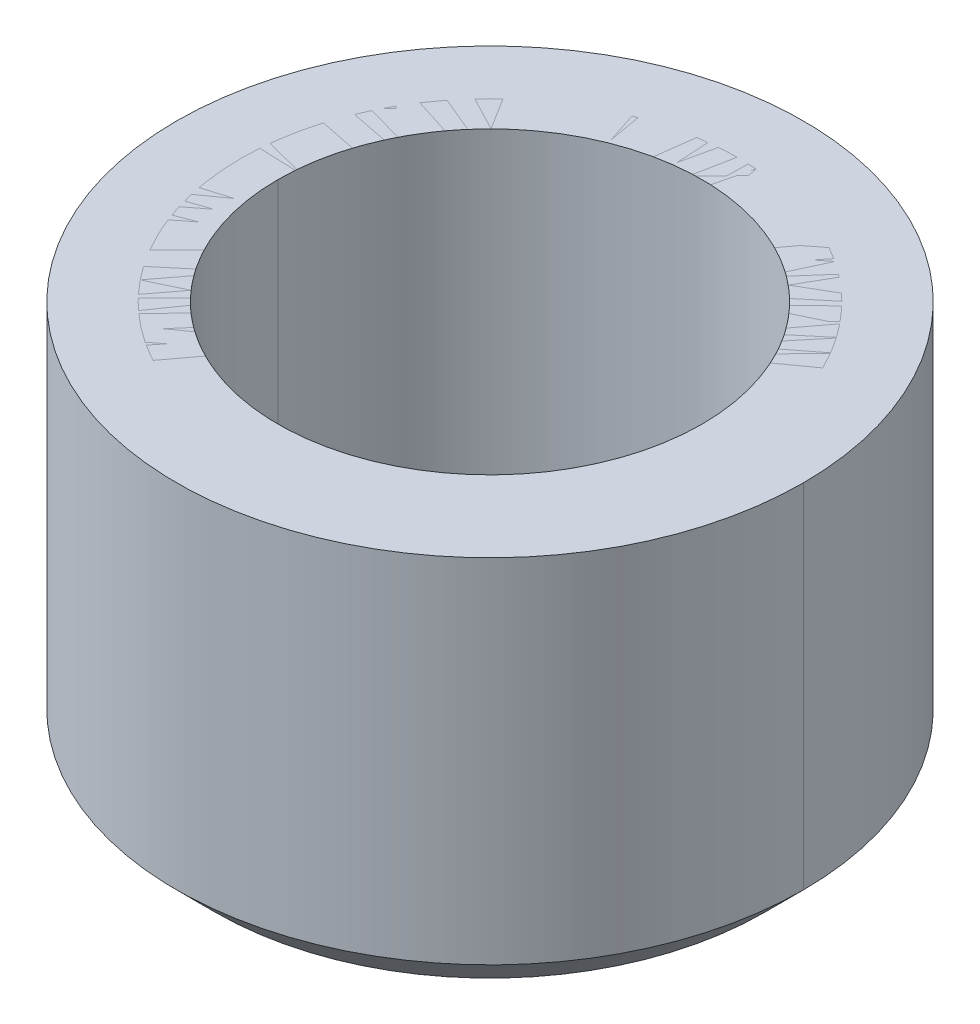
ISO-10303-21;
HEADER;
FILE_DESCRIPTION(('STEP AP214'),'2;1');
FILE_NAME('part.step','',(''),(''),'','','');
FILE_SCHEMA(('AUTOMOTIVE_DESIGN { 1 0 10303 214 1 1 1 1 }'));
ENDSEC;
DATA;
#1=APPLICATION_CONTEXT('core data for automotive mechanical design processes');
#2=APPLICATION_PROTOCOL_DEFINITION('international standard','automotive_design',2000,#1);
#3=PRODUCT_CONTEXT('',#1,'mechanical');
#4=PRODUCT('Part','Part','',(#3));
#5=PRODUCT_RELATED_PRODUCT_CATEGORY('part','',(#4));
#6=PRODUCT_DEFINITION_FORMATION('','',#4);
#7=PRODUCT_DEFINITION_CONTEXT('part definition',#1,'design');
#8=PRODUCT_DEFINITION('design','',#6,#7);
#9=PRODUCT_DEFINITION_SHAPE('','',#8);
#10=(LENGTH_UNIT() NAMED_UNIT(*) SI_UNIT(.MILLI.,.METRE.));
#11=(NAMED_UNIT(*) PLANE_ANGLE_UNIT() SI_UNIT($,.RADIAN.));
#12=(NAMED_UNIT(*) SI_UNIT($,.STERADIAN.) SOLID_ANGLE_UNIT());
#13=UNCERTAINTY_MEASURE_WITH_UNIT(LENGTH_MEASURE(1.E-05),#10,'distance_accuracy_value','');
#14=(GEOMETRIC_REPRESENTATION_CONTEXT(3) GLOBAL_UNCERTAINTY_ASSIGNED_CONTEXT((#13)) GLOBAL_UNIT_ASSIGNED_CONTEXT((#10,
#11,#12)) REPRESENTATION_CONTEXT('',''));
#15=CARTESIAN_POINT('',(0.,0.,0.));
#16=DIRECTION('',(0.,0.,1.));
#17=DIRECTION('',(1.,0.,0.));
#18=AXIS2_PLACEMENT_3D('',#15,#16,#17);
#19=CARTESIAN_POINT('',(0.,9.45,0.));
#20=DIRECTION('',(0.,-1.,0.));
#21=DIRECTION('',(-1.,0.,0.));
#22=AXIS2_PLACEMENT_3D('',#19,#20,#21);
#23=CYLINDRICAL_SURFACE('',#22,3.175);
#24=CARTESIAN_POINT('',(-3.175,5.,0.));
#25=CARTESIAN_POINT('',(-3.175,5.,-0.631260766134238));
#26=CARTESIAN_POINT('',(-2.93331751572333,5.,-1.21501989775916));
#27=CARTESIAN_POINT('',(-2.69194650064295,5.,-1.79802670764221));
#28=CARTESIAN_POINT('',(-2.24506403026729,5.,-2.24506403026729));
#29=CARTESIAN_POINT('',(-1.79895924259534,5.,-2.69132340070859));
#30=CARTESIAN_POINT('',(-1.21501989775916,5.,-2.93331751572333));
#31=CARTESIAN_POINT('',(-0.632096747467422,5.,-3.17489050292465));
#32=CARTESIAN_POINT('',(0.,5.,-3.175));
#33=CARTESIAN_POINT('',(0.630996747490972,5.,-3.17510930652417));
#34=CARTESIAN_POINT('',(1.21501989775916,5.,-2.93331751572333));
#35=CARTESIAN_POINT('',(1.79802670764314,5.,-2.69194650064252));
#36=CARTESIAN_POINT('',(2.24506403026729,5.,-2.24506403026729));
#37=CARTESIAN_POINT('',(2.69132340070859,5.,-1.79895924259485));
#38=CARTESIAN_POINT('',(2.93331751572333,5.,-1.21501989775916));
#39=CARTESIAN_POINT('',(3.175,5.,-0.631832527611024));
#40=CARTESIAN_POINT('',(3.175,5.,0.));
#41=B_SPLINE_CURVE_WITH_KNOTS('',2,(#24,#25,#26,#27,#28,#29,#30,#31,#32,#33,#34,#35,#36,#37,#38,
#39,#40),.UNSPECIFIED.,.F.,.F.,(3,2,2,2,2,2,2,2,3),(0.,0.125,0.25,0.375,0.5,0.625,0.75,0.875,
1.),.UNSPECIFIED.);
#42=CARTESIAN_POINT('',(-3.175,5.,0.));
#43=VERTEX_POINT('',#42);
#44=CARTESIAN_POINT('',(3.175,5.,0.));
#45=VERTEX_POINT('',#44);
#46=EDGE_CURVE('P0_E27',#43,#45,#41,.T.);
#47=ORIENTED_EDGE('',*,*,#46,.F.);
#48=CARTESIAN_POINT('',(-3.175,0.,0.));
#49=DIRECTION('',(0.,1.,0.));
#50=VECTOR('',#49,1.);
#51=LINE('',#48,#50);
#52=CARTESIAN_POINT('',(-3.175,0.,0.));
#53=VERTEX_POINT('',#52);
#54=EDGE_CURVE('P0_E119',#53,#43,#51,.T.);
#55=ORIENTED_EDGE('',*,*,#54,.F.);
#56=CARTESIAN_POINT('',(0.,0.,0.));
#57=DIRECTION('',(0.,-1.,0.));
#58=DIRECTION('',(-1.,0.,0.));
#59=AXIS2_PLACEMENT_3D('',#56,#57,#58);
#60=CIRCLE('',#59,3.175);
#61=CARTESIAN_POINT('',(3.175,0.,0.));
#62=VERTEX_POINT('',#61);
#63=EDGE_CURVE('P0_E121',#62,#53,#60,.F.);
#64=ORIENTED_EDGE('',*,*,#63,.F.);
#65=CARTESIAN_POINT('',(3.175,5.,0.));
#66=DIRECTION('',(0.,-1.,0.));
#67=VECTOR('',#66,1.);
#68=LINE('',#65,#67);
#69=EDGE_CURVE('P0_E11',#45,#62,#68,.T.);
#70=ORIENTED_EDGE('',*,*,#69,.F.);
#71=EDGE_LOOP('',(#47,#55,#64,#70));
#72=FACE_BOUND('',#71,.T.);
#73=ADVANCED_FACE('P0_F16',(#72),#23,.F.);
#74=CARTESIAN_POINT('',(0.,9.45,0.));
#75=DIRECTION('',(0.,-1.,0.));
#76=DIRECTION('',(-1.,0.,0.));
#77=AXIS2_PLACEMENT_3D('',#74,#75,#76);
#78=CYLINDRICAL_SURFACE('',#77,3.175);
#79=CARTESIAN_POINT('',(3.175,5.,0.));
#80=CARTESIAN_POINT('',(3.175,5.,0.63126076613366));
#81=CARTESIAN_POINT('',(2.93331751572333,5.,1.21501989775916));
#82=CARTESIAN_POINT('',(2.69194650064319,5.,1.79802670764222));
#83=CARTESIAN_POINT('',(2.24506403026729,5.,2.24506403026729));
#84=CARTESIAN_POINT('',(1.79895924259498,5.,2.6913234007087));
#85=CARTESIAN_POINT('',(1.21501989775916,5.,2.93331751572333));
#86=CARTESIAN_POINT('',(0.632096747467518,5.,3.17489050292465));
#87=CARTESIAN_POINT('',(0.,5.,3.175));
#88=CARTESIAN_POINT('',(-0.630996747489873,5.,3.17510930652417));
#89=CARTESIAN_POINT('',(-1.21501989775916,5.,2.93331751572333));
#90=CARTESIAN_POINT('',(-1.79802670764237,5.,2.69194650064329));
#91=CARTESIAN_POINT('',(-2.24506403026729,5.,2.24506403026729));
#92=CARTESIAN_POINT('',(-2.69132340070888,5.,1.79895924259456));
#93=CARTESIAN_POINT('',(-2.93331751572333,5.,1.21501989775916));
#94=CARTESIAN_POINT('',(-3.175,5.,0.631832527610618));
#95=CARTESIAN_POINT('',(-3.175,5.,0.));
#96=B_SPLINE_CURVE_WITH_KNOTS('',2,(#79,#80,#81,#82,#83,#84,#85,#86,#87,#88,#89,#90,#91,#92,#93,
#94,#95),.UNSPECIFIED.,.F.,.F.,(3,2,2,2,2,2,2,2,3),(0.,0.125,0.25,0.375,0.5,0.625,0.75,0.875,
1.),.UNSPECIFIED.);
#97=EDGE_CURVE('P0_E72',#45,#43,#96,.T.);
#98=ORIENTED_EDGE('',*,*,#97,.F.);
#99=ORIENTED_EDGE('',*,*,#69,.T.);
#100=CARTESIAN_POINT('',(0.,0.,0.));
#101=DIRECTION('',(0.,-1.,0.));
#102=DIRECTION('',(1.,0.,0.));
#103=AXIS2_PLACEMENT_3D('',#100,#101,#102);
#104=CIRCLE('',#103,3.175);
#105=EDGE_CURVE('P0_E53',#53,#62,#104,.F.);
#106=ORIENTED_EDGE('',*,*,#105,.F.);
#107=ORIENTED_EDGE('',*,*,#54,.T.);
#108=EDGE_LOOP('',(#98,#99,#106,#107));
#109=FACE_BOUND('',#108,.T.);
#110=ADVANCED_FACE('P0_F86',(#109),#78,.F.);
#111=CARTESIAN_POINT('',(0.,5.,0.));
#112=DIRECTION('',(0.,-1.,0.));
#113=DIRECTION('',(0.,0.,-1.));
#114=AXIS2_PLACEMENT_3D('',#111,#112,#113);
#115=PLANE('',#114);
#116=CARTESIAN_POINT('',(-2.7051,5.,0.));
#117=CARTESIAN_POINT('',(-2.7051,5.,0.537791823913939));
#118=CARTESIAN_POINT('',(-2.49918652339628,5.,1.0351969528908));
#119=CARTESIAN_POINT('',(-2.29358450195605,5.,1.5318497299657));
#120=CARTESIAN_POINT('',(-1.91279455378773,5.,1.91279455378773));
#121=CARTESIAN_POINT('',(-1.53278226491155,5.,2.29296140202647));
#122=CARTESIAN_POINT('',(-1.03519695289081,5.,2.49918652339628));
#123=CARTESIAN_POINT('',(-0.538627822739186,5.,2.7049904863753));
#124=CARTESIAN_POINT('',(0.,5.,2.7051));
#125=CARTESIAN_POINT('',(0.537527822770754,5.,2.70520928997308));
#126=CARTESIAN_POINT('',(1.0351969528908,5.,2.49918652339628));
#127=CARTESIAN_POINT('',(1.53184972996585,5.,2.29358450195611));
#128=CARTESIAN_POINT('',(1.91279455378773,5.,1.91279455378773));
#129=CARTESIAN_POINT('',(2.29296140202655,5.,1.53278226491126));
#130=CARTESIAN_POINT('',(2.49918652339628,5.,1.03519695289081));
#131=CARTESIAN_POINT('',(2.7051,5.,0.538363585430298));
#132=CARTESIAN_POINT('',(2.7051,5.,0.));
#133=B_SPLINE_CURVE_WITH_KNOTS('',2,(#116,#117,#118,#119,#120,#121,#122,#123,#124,#125,#126,
#127,#128,#129,#130,#131,#132),.UNSPECIFIED.,.F.,.F.,(3,2,2,2,2,2,2,2,3),(0.,0.125,0.25,0.375,
0.5,0.625,0.75,0.875,1.),.UNSPECIFIED.);
#134=CARTESIAN_POINT('',(-2.7051,5.,0.));
#135=VERTEX_POINT('',#134);
#136=CARTESIAN_POINT('',(2.7051,5.,0.));
#137=VERTEX_POINT('',#136);
#138=EDGE_CURVE('P0_E47',#135,#137,#133,.T.);
#139=ORIENTED_EDGE('',*,*,#138,.T.);
#140=CARTESIAN_POINT('',(2.7051,5.,0.));
#141=CARTESIAN_POINT('',(2.7051,5.,-0.537791823913939));
#142=CARTESIAN_POINT('',(2.49918652339628,5.,-1.0351969528908));
#143=CARTESIAN_POINT('',(2.29358450195605,5.,-1.5318497299657));
#144=CARTESIAN_POINT('',(1.91279455378773,5.,-1.91279455378773));
#145=CARTESIAN_POINT('',(1.53278226491155,5.,-2.29296140202647));
#146=CARTESIAN_POINT('',(1.03519695289081,5.,-2.49918652339628));
#147=CARTESIAN_POINT('',(0.538627822739186,5.,-2.7049904863753));
#148=CARTESIAN_POINT('',(0.,5.,-2.7051));
#149=CARTESIAN_POINT('',(-0.537527822770754,5.,-2.70520928997308));
#150=CARTESIAN_POINT('',(-1.0351969528908,5.,-2.49918652339628));
#151=CARTESIAN_POINT('',(-1.53184972996585,5.,-2.29358450195611));
#152=CARTESIAN_POINT('',(-1.91279455378773,5.,-1.91279455378773));
#153=CARTESIAN_POINT('',(-2.29296140202655,5.,-1.53278226491126));
#154=CARTESIAN_POINT('',(-2.49918652339628,5.,-1.03519695289081));
#155=CARTESIAN_POINT('',(-2.7051,5.,-0.538363585430298));
#156=CARTESIAN_POINT('',(-2.7051,5.,0.));
#157=B_SPLINE_CURVE_WITH_KNOTS('',2,(#140,#141,#142,#143,#144,#145,#146,#147,#148,#149,#150,
#151,#152,#153,#154,#155,#156),.UNSPECIFIED.,.F.,.F.,(3,2,2,2,2,2,2,2,3),(0.,0.125,0.25,0.375,
0.5,0.625,0.75,0.875,1.),.UNSPECIFIED.);
#158=EDGE_CURVE('P0_E51',#137,#135,#157,.T.);
#159=ORIENTED_EDGE('',*,*,#158,.T.);
#160=EDGE_LOOP('',(#139,#159));
#161=FACE_BOUND('',#160,.T.);
#162=ORIENTED_EDGE('',*,*,#46,.T.);
#163=ORIENTED_EDGE('',*,*,#97,.T.);
#164=EDGE_LOOP('',(#162,#163));
#165=FACE_BOUND('',#164,.T.);
#166=ADVANCED_FACE('P0_F17',(#161,#165),#115,.T.);
#167=OPEN_SHELL('',(#73,#110,#166));
#168=SHELL_BASED_SURFACE_MODEL('P0_B1',(#167));
#169=CARTESIAN_POINT('',(0.,0.2499999959053,0.));
#170=DIRECTION('',(0.,1.,0.));
#171=DIRECTION('',(0.,0.,-1.));
#172=AXIS2_PLACEMENT_3D('',#169,#170,#171);
#173=CONICAL_SURFACE('',#172,3.749999995905,0.7853981633973);
#174=DIRECTION('',(-0.707106781186548,0.707106781186548,4.4057720949343E-09));
#175=VECTOR('',#174,1.);
#176=CARTESIAN_POINT('',(-3.49999999481,-5.189897992845E-09,-2.180745930517E-08));
#177=LINE('',#176,#175);
#178=CARTESIAN_POINT('',(-3.5,0.,0.));
#179=VERTEX_POINT('',#178);
#180=CARTESIAN_POINT('',(-4.,0.5,0.));
#181=VERTEX_POINT('',#180);
#182=EDGE_CURVE('P1_E11',#179,#181,#177,.T.);
#183=ORIENTED_EDGE('',*,*,#182,.T.);
#184=CARTESIAN_POINT('',(0.,0.5,0.));
#185=DIRECTION('',(0.,-1.,0.));
#186=DIRECTION('',(-1.,0.,0.));
#187=AXIS2_PLACEMENT_3D('',#184,#185,#186);
#188=CIRCLE('',#187,4.);
#189=CARTESIAN_POINT('',(4.,0.5,0.));
#190=VERTEX_POINT('',#189);
#191=EDGE_CURVE('P1_E20',#181,#190,#188,.T.);
#192=ORIENTED_EDGE('',*,*,#191,.T.);
#193=DIRECTION('',(0.707106781186548,0.707106781186548,-4.4057713824883E-09));
#194=VECTOR('',#193,1.);
#195=CARTESIAN_POINT('',(3.49999999481,-5.189898140875E-09,2.180745920775E-08));
#196=LINE('',#195,#194);
#197=CARTESIAN_POINT('',(3.5,0.,0.));
#198=VERTEX_POINT('',#197);
#199=EDGE_CURVE('P1_E27',#198,#190,#196,.T.);
#200=ORIENTED_EDGE('',*,*,#199,.F.);
#201=CARTESIAN_POINT('',(0.,0.,0.));
#202=DIRECTION('',(0.,-1.,0.));
#203=DIRECTION('',(-1.,0.,0.));
#204=AXIS2_PLACEMENT_3D('',#201,#202,#203);
#205=CIRCLE('',#204,3.5);
#206=EDGE_CURVE('P1_E89',#179,#198,#205,.T.);
#207=ORIENTED_EDGE('',*,*,#206,.F.);
#208=EDGE_LOOP('',(#183,#192,#200,#207));
#209=FACE_BOUND('',#208,.T.);
#210=ADVANCED_FACE('P1_F16',(#209),#173,.T.);
#211=CARTESIAN_POINT('',(0.,0.2499999959053,0.));
#212=DIRECTION('',(0.,1.,0.));
#213=DIRECTION('',(0.,0.,-1.));
#214=AXIS2_PLACEMENT_3D('',#211,#212,#213);
#215=CONICAL_SURFACE('',#214,3.749999995905,0.7853981633973);
#216=ORIENTED_EDGE('',*,*,#199,.T.);
#217=CARTESIAN_POINT('',(0.,0.5,0.));
#218=DIRECTION('',(0.,-1.,0.));
#219=DIRECTION('',(1.,0.,0.));
#220=AXIS2_PLACEMENT_3D('',#217,#218,#219);
#221=CIRCLE('',#220,4.);
#222=EDGE_CURVE('P1_E85',#190,#181,#221,.T.);
#223=ORIENTED_EDGE('',*,*,#222,.T.);
#224=ORIENTED_EDGE('',*,*,#182,.F.);
#225=CARTESIAN_POINT('',(0.,0.,0.));
#226=DIRECTION('',(0.,-1.,0.));
#227=DIRECTION('',(1.,0.,0.));
#228=AXIS2_PLACEMENT_3D('',#225,#226,#227);
#229=CIRCLE('',#228,3.5);
#230=EDGE_CURVE('P1_E84',#198,#179,#229,.T.);
#231=ORIENTED_EDGE('',*,*,#230,.F.);
#232=EDGE_LOOP('',(#216,#223,#224,#231));
#233=FACE_BOUND('',#232,.T.);
#234=ADVANCED_FACE('P1_F82',(#233),#215,.T.);
#235=CARTESIAN_POINT('',(0.,0.,0.));
#236=DIRECTION('',(0.,1.,0.));
#237=DIRECTION('',(1.,0.,0.));
#238=AXIS2_PLACEMENT_3D('',#235,#236,#237);
#239=CYLINDRICAL_SURFACE('',#238,4.);
#240=CARTESIAN_POINT('',(0.,5.,0.));
#241=DIRECTION('',(0.,1.,0.));
#242=DIRECTION('',(-1.,0.,0.));
#243=AXIS2_PLACEMENT_3D('',#240,#241,#242);
#244=CIRCLE('',#243,4.);
#245=CARTESIAN_POINT('',(-4.,5.,0.));
#246=VERTEX_POINT('',#245);
#247=CARTESIAN_POINT('',(4.,5.,0.));
#248=VERTEX_POINT('',#247);
#249=EDGE_CURVE('P1_E110',#246,#248,#244,.T.);
#250=ORIENTED_EDGE('',*,*,#249,.F.);
#251=DIRECTION('',(-9.885526461711E-10,1.,4.153801695735E-09));
#252=VECTOR('',#251,1.);
#253=CARTESIAN_POINT('',(-3.999999995552,0.4999999955515,-1.869210797586E-08));
#254=LINE('',#253,#252);
#255=EDGE_CURVE('P1_E73',#181,#246,#254,.T.);
#256=ORIENTED_EDGE('',*,*,#255,.F.);
#257=ORIENTED_EDGE('',*,*,#222,.F.);
#258=DIRECTION('',(9.885526461711E-10,1.,-4.153801731608E-09));
#259=VECTOR('',#258,1.);
#260=CARTESIAN_POINT('',(3.999999995552,0.4999999955515,1.869210838222E-08));
#261=LINE('',#260,#259);
#262=EDGE_CURVE('P1_E62',#190,#248,#261,.T.);
#263=ORIENTED_EDGE('',*,*,#262,.T.);
#264=EDGE_LOOP('',(#250,#256,#257,#263));
#265=FACE_BOUND('',#264,.T.);
#266=ADVANCED_FACE('P1_F162',(#265),#239,.T.);
#267=CARTESIAN_POINT('',(0.,0.,0.));
#268=DIRECTION('',(0.,1.,0.));
#269=DIRECTION('',(1.,0.,0.));
#270=AXIS2_PLACEMENT_3D('',#267,#268,#269);
#271=CYLINDRICAL_SURFACE('',#270,4.);
#272=ORIENTED_EDGE('',*,*,#191,.F.);
#273=ORIENTED_EDGE('',*,*,#255,.T.);
#274=CARTESIAN_POINT('',(0.,5.,0.));
#275=DIRECTION('',(0.,1.,0.));
#276=DIRECTION('',(1.,0.,0.));
#277=AXIS2_PLACEMENT_3D('',#274,#275,#276);
#278=CIRCLE('',#277,4.);
#279=EDGE_CURVE('P1_E107',#248,#246,#278,.T.);
#280=ORIENTED_EDGE('',*,*,#279,.F.);
#281=ORIENTED_EDGE('',*,*,#262,.F.);
#282=EDGE_LOOP('',(#272,#273,#280,#281));
#283=FACE_BOUND('',#282,.T.);
#284=ADVANCED_FACE('P1_F165',(#283),#271,.T.);
#285=CARTESIAN_POINT('',(-12.02,5.,41.43915557421));
#286=DIRECTION('',(0.,-1.,0.));
#287=DIRECTION('',(0.,0.,-1.));
#288=AXIS2_PLACEMENT_3D('',#285,#286,#287);
#289=PLANE('',#288);
#290=CARTESIAN_POINT('',(0.,5.,0.));
#291=DIRECTION('',(0.,-1.,0.));
#292=DIRECTION('',(1.,0.,0.));
#293=AXIS2_PLACEMENT_3D('',#290,#291,#292);
#294=CIRCLE('',#293,2.7051);
#295=CARTESIAN_POINT('',(2.7051,5.,0.));
#296=VERTEX_POINT('',#295);
#297=CARTESIAN_POINT('',(-2.7051,5.,0.));
#298=VERTEX_POINT('',#297);
#299=EDGE_CURVE('P1_E105',#296,#298,#294,.T.);
#300=ORIENTED_EDGE('',*,*,#299,.T.);
#301=CARTESIAN_POINT('',(0.,5.,0.));
#302=DIRECTION('',(0.,-1.,0.));
#303=DIRECTION('',(-1.,0.,0.));
#304=AXIS2_PLACEMENT_3D('',#301,#302,#303);
#305=CIRCLE('',#304,2.7051);
#306=EDGE_CURVE('P1_E106',#298,#296,#305,.T.);
#307=ORIENTED_EDGE('',*,*,#306,.T.);
#308=EDGE_LOOP('',(#300,#307));
#309=FACE_BOUND('',#308,.T.);
#310=ORIENTED_EDGE('',*,*,#249,.T.);
#311=ORIENTED_EDGE('',*,*,#279,.T.);
#312=EDGE_LOOP('',(#310,#311));
#313=FACE_BOUND('',#312,.T.);
#314=ADVANCED_FACE('P1_F166',(#309,#313),#289,.F.);
#315=CARTESIAN_POINT('',(0.,9.45,0.));
#316=DIRECTION('',(0.,-1.,0.));
#317=DIRECTION('',(-1.,0.,0.));
#318=AXIS2_PLACEMENT_3D('',#315,#316,#317);
#319=CYLINDRICAL_SURFACE('',#318,2.7051);
#320=ORIENTED_EDGE('',*,*,#299,.F.);
#321=DIRECTION('',(0.,-1.,0.));
#322=VECTOR('',#321,1.);
#323=CARTESIAN_POINT('',(2.7051,5.,0.));
#324=LINE('',#323,#322);
#325=CARTESIAN_POINT('',(2.7051,0.,0.));
#326=VERTEX_POINT('',#325);
#327=EDGE_CURVE('P1_E121',#296,#326,#324,.T.);
#328=ORIENTED_EDGE('',*,*,#327,.T.);
#329=CARTESIAN_POINT('',(0.,0.,0.));
#330=DIRECTION('',(0.,-1.,0.));
#331=DIRECTION('',(1.,0.,0.));
#332=AXIS2_PLACEMENT_3D('',#329,#330,#331);
#333=CIRCLE('',#332,2.7051);
#334=CARTESIAN_POINT('',(-2.7051,0.,0.));
#335=VERTEX_POINT('',#334);
#336=EDGE_CURVE('P1_E92',#326,#335,#333,.T.);
#337=ORIENTED_EDGE('',*,*,#336,.T.);
#338=DIRECTION('',(0.,-1.,0.));
#339=VECTOR('',#338,1.);
#340=CARTESIAN_POINT('',(-2.7051,5.,0.));
#341=LINE('',#340,#339);
#342=EDGE_CURVE('P1_E102',#298,#335,#341,.T.);
#343=ORIENTED_EDGE('',*,*,#342,.F.);
#344=EDGE_LOOP('',(#320,#328,#337,#343));
#345=FACE_BOUND('',#344,.T.);
#346=ADVANCED_FACE('P1_F147',(#345),#319,.F.);
#347=CARTESIAN_POINT('',(0.,9.45,0.));
#348=DIRECTION('',(0.,-1.,0.));
#349=DIRECTION('',(-1.,0.,0.));
#350=AXIS2_PLACEMENT_3D('',#347,#348,#349);
#351=CYLINDRICAL_SURFACE('',#350,2.7051);
#352=CARTESIAN_POINT('',(0.,0.,0.));
#353=DIRECTION('',(0.,-1.,0.));
#354=DIRECTION('',(-1.,0.,0.));
#355=AXIS2_PLACEMENT_3D('',#352,#353,#354);
#356=CIRCLE('',#355,2.7051);
#357=EDGE_CURVE('P1_E124',#335,#326,#356,.T.);
#358=ORIENTED_EDGE('',*,*,#357,.T.);
#359=ORIENTED_EDGE('',*,*,#327,.F.);
#360=ORIENTED_EDGE('',*,*,#306,.F.);
#361=ORIENTED_EDGE('',*,*,#342,.T.);
#362=EDGE_LOOP('',(#358,#359,#360,#361));
#363=FACE_BOUND('',#362,.T.);
#364=ADVANCED_FACE('P1_F151',(#363),#351,.F.);
#365=CARTESIAN_POINT('',(0.,0.,0.));
#366=DIRECTION('',(0.,1.,0.));
#367=DIRECTION('',(1.,0.,0.));
#368=AXIS2_PLACEMENT_3D('',#365,#366,#367);
#369=PLANE('',#368);
#370=ORIENTED_EDGE('',*,*,#336,.F.);
#371=ORIENTED_EDGE('',*,*,#357,.F.);
#372=EDGE_LOOP('',(#370,#371));
#373=FACE_BOUND('',#372,.T.);
#374=ORIENTED_EDGE('',*,*,#230,.T.);
#375=ORIENTED_EDGE('',*,*,#206,.T.);
#376=EDGE_LOOP('',(#374,#375));
#377=FACE_BOUND('',#376,.T.);
#378=ADVANCED_FACE('P1_F18',(#373,#377),#369,.F.);
#379=CLOSED_SHELL('',(#210,#234,#266,#284,#314,#346,#364,#378));
#380=MANIFOLD_SOLID_BREP('P1_B1',#379);
#381=ADVANCED_BREP_SHAPE_REPRESENTATION('',(#18,#380),#14);
#382=MANIFOLD_SURFACE_SHAPE_REPRESENTATION('',(#18,#168),#14);
#383=SHAPE_REPRESENTATION('',(#18),#14);
#384=SHAPE_DEFINITION_REPRESENTATION(#9,#383);
#385=SHAPE_REPRESENTATION_RELATIONSHIP('','',#383,#381);
#386=SHAPE_REPRESENTATION_RELATIONSHIP('','',#383,#382);
ENDSEC;
END-ISO-10303-21;
